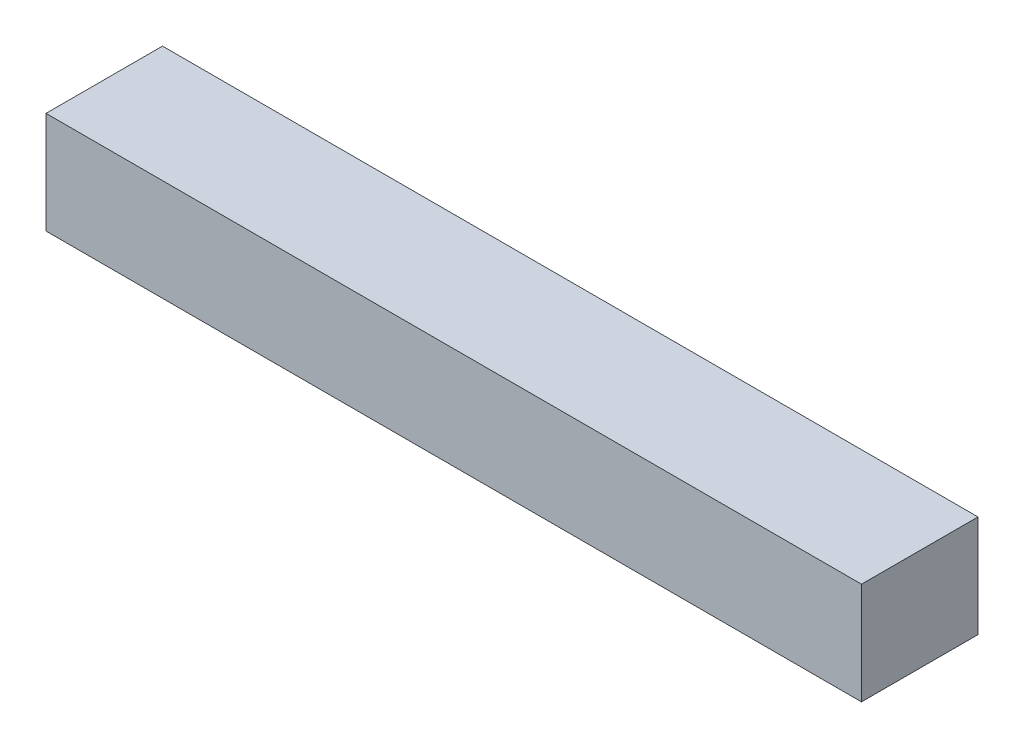
ISO-10303-21;
HEADER;
FILE_DESCRIPTION(('STEP AP214'),'2;1');
FILE_NAME('part.step','',(''),(''),'','','');
FILE_SCHEMA(('AUTOMOTIVE_DESIGN { 1 0 10303 214 1 1 1 1 }'));
ENDSEC;
DATA;
#1=APPLICATION_CONTEXT('core data for automotive mechanical design processes');
#2=APPLICATION_PROTOCOL_DEFINITION('international standard','automotive_design',2000,#1);
#3=PRODUCT_CONTEXT('',#1,'mechanical');
#4=PRODUCT('Part','Part','',(#3));
#5=PRODUCT_RELATED_PRODUCT_CATEGORY('part','',(#4));
#6=PRODUCT_DEFINITION_FORMATION('','',#4);
#7=PRODUCT_DEFINITION_CONTEXT('part definition',#1,'design');
#8=PRODUCT_DEFINITION('design','',#6,#7);
#9=PRODUCT_DEFINITION_SHAPE('','',#8);
#10=(LENGTH_UNIT() NAMED_UNIT(*) SI_UNIT(.MILLI.,.METRE.));
#11=(NAMED_UNIT(*) PLANE_ANGLE_UNIT() SI_UNIT($,.RADIAN.));
#12=(NAMED_UNIT(*) SI_UNIT($,.STERADIAN.) SOLID_ANGLE_UNIT());
#13=UNCERTAINTY_MEASURE_WITH_UNIT(LENGTH_MEASURE(1.E-05),#10,'distance_accuracy_value','');
#14=(GEOMETRIC_REPRESENTATION_CONTEXT(3) GLOBAL_UNCERTAINTY_ASSIGNED_CONTEXT((#13)) GLOBAL_UNIT_ASSIGNED_CONTEXT((#10,
#11,#12)) REPRESENTATION_CONTEXT('',''));
#15=CARTESIAN_POINT('',(0.,0.,0.));
#16=DIRECTION('',(0.,0.,1.));
#17=DIRECTION('',(1.,0.,0.));
#18=AXIS2_PLACEMENT_3D('',#15,#16,#17);
#19=CARTESIAN_POINT('',(42.,-5.79964005372387,9.67039862164474));
#20=DIRECTION('',(0.,0.,1.));
#21=DIRECTION('',(0.,-1.,0.));
#22=AXIS2_PLACEMENT_3D('',#19,#20,#21);
#23=PLANE('',#22);
#24=DIRECTION('',(0.,1.,0.));
#25=VECTOR('',#24,1.);
#26=CARTESIAN_POINT('',(14.,-5.79964005372387,9.67039862164474));
#27=LINE('',#26,#25);
#28=CARTESIAN_POINT('',(14.,-9.29964005372387,9.67039862164474));
#29=VERTEX_POINT('',#28);
#30=CARTESIAN_POINT('',(14.,-5.79964005372387,9.67039862164474));
#31=VERTEX_POINT('',#30);
#32=EDGE_CURVE('E106',#29,#31,#27,.T.);
#33=ORIENTED_EDGE('',*,*,#32,.T.);
#34=DIRECTION('',(-1.,0.,0.));
#35=VECTOR('',#34,1.);
#36=CARTESIAN_POINT('',(42.,-5.79964005372387,9.67039862164474));
#37=LINE('',#36,#35);
#38=CARTESIAN_POINT('',(42.,-5.79964005372387,9.67039862164474));
#39=VERTEX_POINT('',#38);
#40=EDGE_CURVE('E11',#39,#31,#37,.T.);
#41=ORIENTED_EDGE('',*,*,#40,.F.);
#42=DIRECTION('',(0.,1.,0.));
#43=VECTOR('',#42,1.);
#44=CARTESIAN_POINT('',(42.,-5.79964005372387,9.67039862164474));
#45=LINE('',#44,#43);
#46=CARTESIAN_POINT('',(42.,-9.29964005372387,9.67039862164474));
#47=VERTEX_POINT('',#46);
#48=EDGE_CURVE('E90',#47,#39,#45,.T.);
#49=ORIENTED_EDGE('',*,*,#48,.F.);
#50=DIRECTION('',(-1.,0.,0.));
#51=VECTOR('',#50,1.);
#52=CARTESIAN_POINT('',(42.,-9.29964005372387,9.67039862164474));
#53=LINE('',#52,#51);
#54=EDGE_CURVE('E102',#47,#29,#53,.T.);
#55=ORIENTED_EDGE('',*,*,#54,.T.);
#56=EDGE_LOOP('',(#33,#41,#49,#55));
#57=FACE_BOUND('',#56,.T.);
#58=ADVANCED_FACE('F38',(#57),#23,.F.);
#59=CARTESIAN_POINT('',(42.,-5.79964005372387,9.67039862164474));
#60=DIRECTION('',(0.,-1.,0.));
#61=DIRECTION('',(0.,0.,-1.));
#62=AXIS2_PLACEMENT_3D('',#59,#60,#61);
#63=PLANE('',#62);
#64=DIRECTION('',(0.,0.,1.));
#65=VECTOR('',#64,1.);
#66=CARTESIAN_POINT('',(14.,-5.79964005372387,9.67039862164474));
#67=LINE('',#66,#65);
#68=CARTESIAN_POINT('',(14.,-5.79964005372387,13.6703986216447));
#69=VERTEX_POINT('',#68);
#70=EDGE_CURVE('E95',#31,#69,#67,.T.);
#71=ORIENTED_EDGE('',*,*,#70,.T.);
#72=DIRECTION('',(-1.,0.,0.));
#73=VECTOR('',#72,1.);
#74=CARTESIAN_POINT('',(42.,-5.79964005372387,13.6703986216447));
#75=LINE('',#74,#73);
#76=CARTESIAN_POINT('',(42.,-5.79964005372387,13.6703986216447));
#77=VERTEX_POINT('',#76);
#78=EDGE_CURVE('E47',#77,#69,#75,.T.);
#79=ORIENTED_EDGE('',*,*,#78,.F.);
#80=DIRECTION('',(0.,0.,1.));
#81=VECTOR('',#80,1.);
#82=CARTESIAN_POINT('',(42.,-5.79964005372387,9.67039862164474));
#83=LINE('',#82,#81);
#84=EDGE_CURVE('E85',#39,#77,#83,.T.);
#85=ORIENTED_EDGE('',*,*,#84,.F.);
#86=ORIENTED_EDGE('',*,*,#40,.T.);
#87=EDGE_LOOP('',(#71,#79,#85,#86));
#88=FACE_BOUND('',#87,.T.);
#89=ADVANCED_FACE('F94',(#88),#63,.F.);
#90=CARTESIAN_POINT('',(42.,-5.79964005372387,13.6703986216447));
#91=DIRECTION('',(0.,0.,-1.));
#92=DIRECTION('',(-1.,0.,0.));
#93=AXIS2_PLACEMENT_3D('',#90,#91,#92);
#94=PLANE('',#93);
#95=DIRECTION('',(0.,-1.,0.));
#96=VECTOR('',#95,1.);
#97=CARTESIAN_POINT('',(14.,-5.79964005372387,13.6703986216447));
#98=LINE('',#97,#96);
#99=CARTESIAN_POINT('',(14.,-9.29964005372387,13.6703986216447));
#100=VERTEX_POINT('',#99);
#101=EDGE_CURVE('E72',#69,#100,#98,.T.);
#102=ORIENTED_EDGE('',*,*,#101,.T.);
#103=DIRECTION('',(-1.,0.,0.));
#104=VECTOR('',#103,1.);
#105=CARTESIAN_POINT('',(42.,-9.29964005372387,13.6703986216447));
#106=LINE('',#105,#104);
#107=CARTESIAN_POINT('',(42.,-9.29964005372387,13.6703986216447));
#108=VERTEX_POINT('',#107);
#109=EDGE_CURVE('E97',#108,#100,#106,.T.);
#110=ORIENTED_EDGE('',*,*,#109,.F.);
#111=DIRECTION('',(0.,-1.,0.));
#112=VECTOR('',#111,1.);
#113=CARTESIAN_POINT('',(42.,-5.79964005372387,13.6703986216447));
#114=LINE('',#113,#112);
#115=EDGE_CURVE('E88',#77,#108,#114,.T.);
#116=ORIENTED_EDGE('',*,*,#115,.F.);
#117=ORIENTED_EDGE('',*,*,#78,.T.);
#118=EDGE_LOOP('',(#102,#110,#116,#117));
#119=FACE_BOUND('',#118,.T.);
#120=ADVANCED_FACE('F98',(#119),#94,.F.);
#121=CARTESIAN_POINT('',(42.,-9.29964005372387,9.67039862164474));
#122=DIRECTION('',(0.,1.,0.));
#123=DIRECTION('',(0.,0.,1.));
#124=AXIS2_PLACEMENT_3D('',#121,#122,#123);
#125=PLANE('',#124);
#126=DIRECTION('',(0.,0.,-1.));
#127=VECTOR('',#126,1.);
#128=CARTESIAN_POINT('',(14.,-9.29964005372387,9.67039862164474));
#129=LINE('',#128,#127);
#130=EDGE_CURVE('E78',#100,#29,#129,.T.);
#131=ORIENTED_EDGE('',*,*,#130,.T.);
#132=ORIENTED_EDGE('',*,*,#54,.F.);
#133=DIRECTION('',(0.,0.,-1.));
#134=VECTOR('',#133,1.);
#135=CARTESIAN_POINT('',(42.,-9.29964005372387,9.67039862164474));
#136=LINE('',#135,#134);
#137=EDGE_CURVE('E55',#108,#47,#136,.T.);
#138=ORIENTED_EDGE('',*,*,#137,.F.);
#139=ORIENTED_EDGE('',*,*,#109,.T.);
#140=EDGE_LOOP('',(#131,#132,#138,#139));
#141=FACE_BOUND('',#140,.T.);
#142=ADVANCED_FACE('F119',(#141),#125,.F.);
#143=CARTESIAN_POINT('',(42.,-3.77482002686194,5.83519931082237));
#144=DIRECTION('',(-1.,0.,0.));
#145=DIRECTION('',(0.,0.,1.));
#146=AXIS2_PLACEMENT_3D('',#143,#144,#145);
#147=PLANE('',#146);
#148=ORIENTED_EDGE('',*,*,#48,.T.);
#149=ORIENTED_EDGE('',*,*,#84,.T.);
#150=ORIENTED_EDGE('',*,*,#115,.T.);
#151=ORIENTED_EDGE('',*,*,#137,.T.);
#152=EDGE_LOOP('',(#148,#149,#150,#151));
#153=FACE_BOUND('',#152,.T.);
#154=ADVANCED_FACE('F86',(#153),#147,.F.);
#155=CARTESIAN_POINT('',(14.,-3.77482002686194,5.83519931082237));
#156=DIRECTION('',(-1.,0.,0.));
#157=DIRECTION('',(0.,0.,1.));
#158=AXIS2_PLACEMENT_3D('',#155,#156,#157);
#159=PLANE('',#158);
#160=ORIENTED_EDGE('',*,*,#32,.F.);
#161=ORIENTED_EDGE('',*,*,#130,.F.);
#162=ORIENTED_EDGE('',*,*,#101,.F.);
#163=ORIENTED_EDGE('',*,*,#70,.F.);
#164=EDGE_LOOP('',(#160,#161,#162,#163));
#165=FACE_BOUND('',#164,.T.);
#166=ADVANCED_FACE('F122',(#165),#159,.T.);
#167=CLOSED_SHELL('',(#58,#89,#120,#142,#154,#166));
#168=MANIFOLD_SOLID_BREP('B2',#167);
#169=ADVANCED_BREP_SHAPE_REPRESENTATION('',(#18,#168),#14);
#170=SHAPE_DEFINITION_REPRESENTATION(#9,#169);
ENDSEC;
END-ISO-10303-21;
